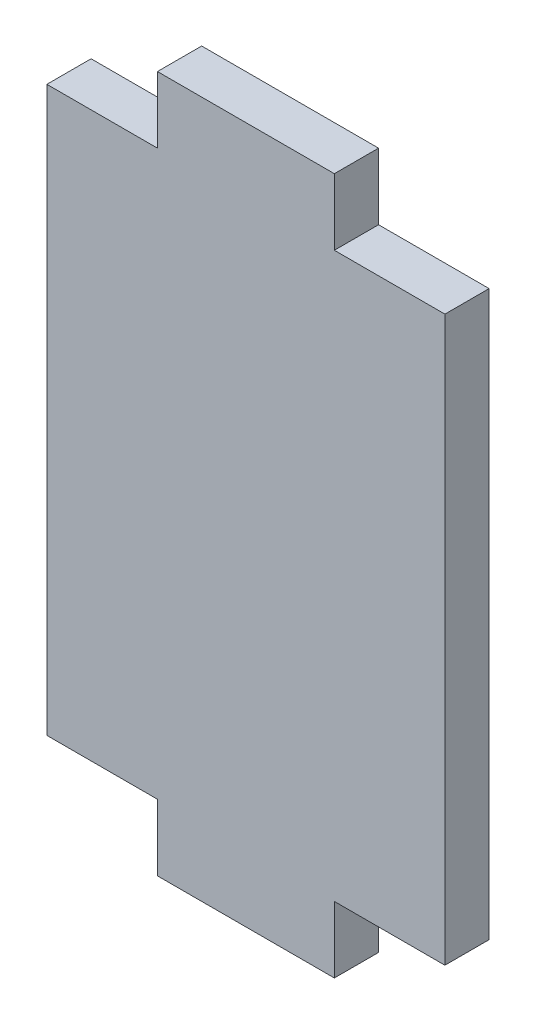
ISO-10303-21;
HEADER;
FILE_DESCRIPTION(('STEP AP214'),'2;1');
FILE_NAME('part.step','',(''),(''),'','','');
FILE_SCHEMA(('AUTOMOTIVE_DESIGN { 1 0 10303 214 1 1 1 1 }'));
ENDSEC;
DATA;
#1=APPLICATION_CONTEXT('core data for automotive mechanical design processes');
#2=APPLICATION_PROTOCOL_DEFINITION('international standard','automotive_design',2000,#1);
#3=PRODUCT_CONTEXT('',#1,'mechanical');
#4=PRODUCT('Part','Part','',(#3));
#5=PRODUCT_RELATED_PRODUCT_CATEGORY('part','',(#4));
#6=PRODUCT_DEFINITION_FORMATION('','',#4);
#7=PRODUCT_DEFINITION_CONTEXT('part definition',#1,'design');
#8=PRODUCT_DEFINITION('design','',#6,#7);
#9=PRODUCT_DEFINITION_SHAPE('','',#8);
#10=(LENGTH_UNIT() NAMED_UNIT(*) SI_UNIT(.MILLI.,.METRE.));
#11=(NAMED_UNIT(*) PLANE_ANGLE_UNIT() SI_UNIT($,.RADIAN.));
#12=(NAMED_UNIT(*) SI_UNIT($,.STERADIAN.) SOLID_ANGLE_UNIT());
#13=UNCERTAINTY_MEASURE_WITH_UNIT(LENGTH_MEASURE(1.E-05),#10,'distance_accuracy_value','');
#14=(GEOMETRIC_REPRESENTATION_CONTEXT(3) GLOBAL_UNCERTAINTY_ASSIGNED_CONTEXT((#13)) GLOBAL_UNIT_ASSIGNED_CONTEXT((#10,
#11,#12)) REPRESENTATION_CONTEXT('',''));
#15=CARTESIAN_POINT('',(0.,0.,0.));
#16=DIRECTION('',(0.,0.,1.));
#17=DIRECTION('',(1.,0.,0.));
#18=AXIS2_PLACEMENT_3D('',#15,#16,#17);
#19=CARTESIAN_POINT('',(0.,0.,2.));
#20=DIRECTION('',(-1.,0.,0.));
#21=DIRECTION('',(0.,0.,1.));
#22=AXIS2_PLACEMENT_3D('',#19,#20,#21);
#23=PLANE('',#22);
#24=DIRECTION('',(0.,1.,0.));
#25=VECTOR('',#24,1.);
#26=CARTESIAN_POINT('',(0.,0.,0.));
#27=LINE('',#26,#25);
#28=CARTESIAN_POINT('',(0.,-3.,0.));
#29=VERTEX_POINT('',#28);
#30=CARTESIAN_POINT('',(0.,0.,0.));
#31=VERTEX_POINT('',#30);
#32=EDGE_CURVE('E152',#29,#31,#27,.T.);
#33=ORIENTED_EDGE('',*,*,#32,.T.);
#34=DIRECTION('',(0.,0.,-1.));
#35=VECTOR('',#34,1.);
#36=CARTESIAN_POINT('',(0.,0.,2.));
#37=LINE('',#36,#35);
#38=CARTESIAN_POINT('',(0.,0.,2.));
#39=VERTEX_POINT('',#38);
#40=EDGE_CURVE('E11',#39,#31,#37,.T.);
#41=ORIENTED_EDGE('',*,*,#40,.F.);
#42=DIRECTION('',(0.,1.,0.));
#43=VECTOR('',#42,1.);
#44=CARTESIAN_POINT('',(0.,0.,2.));
#45=LINE('',#44,#43);
#46=CARTESIAN_POINT('',(0.,-3.,2.));
#47=VERTEX_POINT('',#46);
#48=EDGE_CURVE('E174',#47,#39,#45,.T.);
#49=ORIENTED_EDGE('',*,*,#48,.F.);
#50=DIRECTION('',(0.,0.,-1.));
#51=VECTOR('',#50,1.);
#52=CARTESIAN_POINT('',(0.,-3.,2.));
#53=LINE('',#52,#51);
#54=EDGE_CURVE('E148',#47,#29,#53,.T.);
#55=ORIENTED_EDGE('',*,*,#54,.T.);
#56=EDGE_LOOP('',(#33,#41,#49,#55));
#57=FACE_BOUND('',#56,.T.);
#58=ADVANCED_FACE('F32',(#57),#23,.F.);
#59=CARTESIAN_POINT('',(0.,0.,2.));
#60=DIRECTION('',(0.,-1.,0.));
#61=DIRECTION('',(1.,0.,0.));
#62=AXIS2_PLACEMENT_3D('',#59,#60,#61);
#63=PLANE('',#62);
#64=DIRECTION('',(-1.,0.,0.));
#65=VECTOR('',#64,1.);
#66=CARTESIAN_POINT('',(0.,0.,0.));
#67=LINE('',#66,#65);
#68=CARTESIAN_POINT('',(-8.,0.,0.));
#69=VERTEX_POINT('',#68);
#70=EDGE_CURVE('E155',#31,#69,#67,.T.);
#71=ORIENTED_EDGE('',*,*,#70,.T.);
#72=DIRECTION('',(0.,0.,-1.));
#73=VECTOR('',#72,1.);
#74=CARTESIAN_POINT('',(-8.,0.,2.));
#75=LINE('',#74,#73);
#76=CARTESIAN_POINT('',(-8.,0.,2.));
#77=VERTEX_POINT('',#76);
#78=EDGE_CURVE('E40',#77,#69,#75,.T.);
#79=ORIENTED_EDGE('',*,*,#78,.F.);
#80=DIRECTION('',(-1.,0.,0.));
#81=VECTOR('',#80,1.);
#82=CARTESIAN_POINT('',(0.,0.,2.));
#83=LINE('',#82,#81);
#84=EDGE_CURVE('E103',#39,#77,#83,.T.);
#85=ORIENTED_EDGE('',*,*,#84,.F.);
#86=ORIENTED_EDGE('',*,*,#40,.T.);
#87=EDGE_LOOP('',(#71,#79,#85,#86));
#88=FACE_BOUND('',#87,.T.);
#89=ADVANCED_FACE('F252',(#88),#63,.F.);
#90=CARTESIAN_POINT('',(-8.,0.,2.));
#91=DIRECTION('',(1.,0.,0.));
#92=DIRECTION('',(0.,0.,-1.));
#93=AXIS2_PLACEMENT_3D('',#90,#91,#92);
#94=PLANE('',#93);
#95=DIRECTION('',(0.,-1.,0.));
#96=VECTOR('',#95,1.);
#97=CARTESIAN_POINT('',(-8.,0.,0.));
#98=LINE('',#97,#96);
#99=CARTESIAN_POINT('',(-8.,-3.,0.));
#100=VERTEX_POINT('',#99);
#101=EDGE_CURVE('E157',#69,#100,#98,.T.);
#102=ORIENTED_EDGE('',*,*,#101,.T.);
#103=DIRECTION('',(0.,0.,-1.));
#104=VECTOR('',#103,1.);
#105=CARTESIAN_POINT('',(-8.,-3.,2.));
#106=LINE('',#105,#104);
#107=CARTESIAN_POINT('',(-8.,-3.,2.));
#108=VERTEX_POINT('',#107);
#109=EDGE_CURVE('E193',#108,#100,#106,.T.);
#110=ORIENTED_EDGE('',*,*,#109,.F.);
#111=DIRECTION('',(0.,-1.,0.));
#112=VECTOR('',#111,1.);
#113=CARTESIAN_POINT('',(-8.,0.,2.));
#114=LINE('',#113,#112);
#115=EDGE_CURVE('E201',#77,#108,#114,.T.);
#116=ORIENTED_EDGE('',*,*,#115,.F.);
#117=ORIENTED_EDGE('',*,*,#78,.T.);
#118=EDGE_LOOP('',(#102,#110,#116,#117));
#119=FACE_BOUND('',#118,.T.);
#120=ADVANCED_FACE('F199',(#119),#94,.F.);
#121=CARTESIAN_POINT('',(-8.,-3.,2.));
#122=DIRECTION('',(0.,-1.,0.));
#123=DIRECTION('',(0.,0.,-1.));
#124=AXIS2_PLACEMENT_3D('',#121,#122,#123);
#125=PLANE('',#124);
#126=DIRECTION('',(-1.,0.,0.));
#127=VECTOR('',#126,1.);
#128=CARTESIAN_POINT('',(-8.,-3.,0.));
#129=LINE('',#128,#127);
#130=CARTESIAN_POINT('',(-13.,-3.,0.));
#131=VERTEX_POINT('',#130);
#132=EDGE_CURVE('E159',#100,#131,#129,.T.);
#133=ORIENTED_EDGE('',*,*,#132,.T.);
#134=DIRECTION('',(0.,0.,-1.));
#135=VECTOR('',#134,1.);
#136=CARTESIAN_POINT('',(-13.,-3.,2.));
#137=LINE('',#136,#135);
#138=CARTESIAN_POINT('',(-13.,-3.,2.));
#139=VERTEX_POINT('',#138);
#140=EDGE_CURVE('E190',#139,#131,#137,.T.);
#141=ORIENTED_EDGE('',*,*,#140,.F.);
#142=DIRECTION('',(-1.,0.,0.));
#143=VECTOR('',#142,1.);
#144=CARTESIAN_POINT('',(-8.,-3.,2.));
#145=LINE('',#144,#143);
#146=EDGE_CURVE('E219',#108,#139,#145,.T.);
#147=ORIENTED_EDGE('',*,*,#146,.F.);
#148=ORIENTED_EDGE('',*,*,#109,.T.);
#149=EDGE_LOOP('',(#133,#141,#147,#148));
#150=FACE_BOUND('',#149,.T.);
#151=ADVANCED_FACE('F210',(#150),#125,.F.);
#152=CARTESIAN_POINT('',(-13.,-3.,2.));
#153=DIRECTION('',(1.,0.,0.));
#154=DIRECTION('',(0.,1.,0.));
#155=AXIS2_PLACEMENT_3D('',#152,#153,#154);
#156=PLANE('',#155);
#157=DIRECTION('',(0.,-1.,0.));
#158=VECTOR('',#157,1.);
#159=CARTESIAN_POINT('',(-13.,-3.,0.));
#160=LINE('',#159,#158);
#161=CARTESIAN_POINT('',(-13.,-28.5,0.));
#162=VERTEX_POINT('',#161);
#163=EDGE_CURVE('E161',#131,#162,#160,.T.);
#164=ORIENTED_EDGE('',*,*,#163,.T.);
#165=DIRECTION('',(0.,0.,-1.));
#166=VECTOR('',#165,1.);
#167=CARTESIAN_POINT('',(-13.,-28.5,2.));
#168=LINE('',#167,#166);
#169=CARTESIAN_POINT('',(-13.,-28.5,2.));
#170=VERTEX_POINT('',#169);
#171=EDGE_CURVE('E187',#170,#162,#168,.T.);
#172=ORIENTED_EDGE('',*,*,#171,.F.);
#173=DIRECTION('',(0.,-1.,0.));
#174=VECTOR('',#173,1.);
#175=CARTESIAN_POINT('',(-13.,-3.,2.));
#176=LINE('',#175,#174);
#177=EDGE_CURVE('E216',#139,#170,#176,.T.);
#178=ORIENTED_EDGE('',*,*,#177,.F.);
#179=ORIENTED_EDGE('',*,*,#140,.T.);
#180=EDGE_LOOP('',(#164,#172,#178,#179));
#181=FACE_BOUND('',#180,.T.);
#182=ADVANCED_FACE('F214',(#181),#156,.F.);
#183=CARTESIAN_POINT('',(-8.,-28.5,2.));
#184=DIRECTION('',(0.,1.,0.));
#185=DIRECTION('',(-1.,0.,0.));
#186=AXIS2_PLACEMENT_3D('',#183,#184,#185);
#187=PLANE('',#186);
#188=DIRECTION('',(1.,0.,0.));
#189=VECTOR('',#188,1.);
#190=CARTESIAN_POINT('',(-8.,-28.5,0.));
#191=LINE('',#190,#189);
#192=CARTESIAN_POINT('',(-8.,-28.5,0.));
#193=VERTEX_POINT('',#192);
#194=EDGE_CURVE('E163',#162,#193,#191,.T.);
#195=ORIENTED_EDGE('',*,*,#194,.T.);
#196=DIRECTION('',(0.,0.,-1.));
#197=VECTOR('',#196,1.);
#198=CARTESIAN_POINT('',(-8.,-28.5,2.));
#199=LINE('',#198,#197);
#200=CARTESIAN_POINT('',(-8.,-28.5,2.));
#201=VERTEX_POINT('',#200);
#202=EDGE_CURVE('E184',#201,#193,#199,.T.);
#203=ORIENTED_EDGE('',*,*,#202,.F.);
#204=DIRECTION('',(1.,0.,0.));
#205=VECTOR('',#204,1.);
#206=CARTESIAN_POINT('',(-8.,-28.5,2.));
#207=LINE('',#206,#205);
#208=EDGE_CURVE('E218',#170,#201,#207,.T.);
#209=ORIENTED_EDGE('',*,*,#208,.F.);
#210=ORIENTED_EDGE('',*,*,#171,.T.);
#211=EDGE_LOOP('',(#195,#203,#209,#210));
#212=FACE_BOUND('',#211,.T.);
#213=ADVANCED_FACE('F265',(#212),#187,.F.);
#214=CARTESIAN_POINT('',(-8.,-31.5,2.));
#215=DIRECTION('',(1.,0.,0.));
#216=DIRECTION('',(0.,0.,-1.));
#217=AXIS2_PLACEMENT_3D('',#214,#215,#216);
#218=PLANE('',#217);
#219=DIRECTION('',(0.,-1.,0.));
#220=VECTOR('',#219,1.);
#221=CARTESIAN_POINT('',(-8.,-31.5,0.));
#222=LINE('',#221,#220);
#223=CARTESIAN_POINT('',(-8.,-31.5,0.));
#224=VERTEX_POINT('',#223);
#225=EDGE_CURVE('E165',#193,#224,#222,.T.);
#226=ORIENTED_EDGE('',*,*,#225,.T.);
#227=DIRECTION('',(0.,0.,-1.));
#228=VECTOR('',#227,1.);
#229=CARTESIAN_POINT('',(-8.,-31.5,2.));
#230=LINE('',#229,#228);
#231=CARTESIAN_POINT('',(-8.,-31.5,2.));
#232=VERTEX_POINT('',#231);
#233=EDGE_CURVE('E181',#232,#224,#230,.T.);
#234=ORIENTED_EDGE('',*,*,#233,.F.);
#235=DIRECTION('',(0.,-1.,0.));
#236=VECTOR('',#235,1.);
#237=CARTESIAN_POINT('',(-8.,-31.5,2.));
#238=LINE('',#237,#236);
#239=EDGE_CURVE('E221',#201,#232,#238,.T.);
#240=ORIENTED_EDGE('',*,*,#239,.F.);
#241=ORIENTED_EDGE('',*,*,#202,.T.);
#242=EDGE_LOOP('',(#226,#234,#240,#241));
#243=FACE_BOUND('',#242,.T.);
#244=ADVANCED_FACE('F268',(#243),#218,.F.);
#245=CARTESIAN_POINT('',(0.,-31.5,2.));
#246=DIRECTION('',(0.,1.,0.));
#247=DIRECTION('',(0.,0.,1.));
#248=AXIS2_PLACEMENT_3D('',#245,#246,#247);
#249=PLANE('',#248);
#250=DIRECTION('',(1.,0.,0.));
#251=VECTOR('',#250,1.);
#252=CARTESIAN_POINT('',(0.,-31.5,0.));
#253=LINE('',#252,#251);
#254=CARTESIAN_POINT('',(0.,-31.5,0.));
#255=VERTEX_POINT('',#254);
#256=EDGE_CURVE('E167',#224,#255,#253,.T.);
#257=ORIENTED_EDGE('',*,*,#256,.T.);
#258=DIRECTION('',(0.,0.,-1.));
#259=VECTOR('',#258,1.);
#260=CARTESIAN_POINT('',(0.,-31.5,2.));
#261=LINE('',#260,#259);
#262=CARTESIAN_POINT('',(0.,-31.5,2.));
#263=VERTEX_POINT('',#262);
#264=EDGE_CURVE('E178',#263,#255,#261,.T.);
#265=ORIENTED_EDGE('',*,*,#264,.F.);
#266=DIRECTION('',(1.,0.,0.));
#267=VECTOR('',#266,1.);
#268=CARTESIAN_POINT('',(0.,-31.5,2.));
#269=LINE('',#268,#267);
#270=EDGE_CURVE('E227',#232,#263,#269,.T.);
#271=ORIENTED_EDGE('',*,*,#270,.F.);
#272=ORIENTED_EDGE('',*,*,#233,.T.);
#273=EDGE_LOOP('',(#257,#265,#271,#272));
#274=FACE_BOUND('',#273,.T.);
#275=ADVANCED_FACE('F233',(#274),#249,.F.);
#276=CARTESIAN_POINT('',(0.,-31.5,2.));
#277=DIRECTION('',(-1.,0.,0.));
#278=DIRECTION('',(0.,0.,1.));
#279=AXIS2_PLACEMENT_3D('',#276,#277,#278);
#280=PLANE('',#279);
#281=DIRECTION('',(0.,1.,0.));
#282=VECTOR('',#281,1.);
#283=CARTESIAN_POINT('',(0.,-31.5,0.));
#284=LINE('',#283,#282);
#285=CARTESIAN_POINT('',(0.,-28.5,0.));
#286=VERTEX_POINT('',#285);
#287=EDGE_CURVE('E169',#255,#286,#284,.T.);
#288=ORIENTED_EDGE('',*,*,#287,.T.);
#289=DIRECTION('',(0.,0.,-1.));
#290=VECTOR('',#289,1.);
#291=CARTESIAN_POINT('',(0.,-28.5,2.));
#292=LINE('',#291,#290);
#293=CARTESIAN_POINT('',(0.,-28.5,2.));
#294=VERTEX_POINT('',#293);
#295=EDGE_CURVE('E143',#294,#286,#292,.T.);
#296=ORIENTED_EDGE('',*,*,#295,.F.);
#297=DIRECTION('',(0.,1.,0.));
#298=VECTOR('',#297,1.);
#299=CARTESIAN_POINT('',(0.,-31.5,2.));
#300=LINE('',#299,#298);
#301=EDGE_CURVE('E134',#263,#294,#300,.T.);
#302=ORIENTED_EDGE('',*,*,#301,.F.);
#303=ORIENTED_EDGE('',*,*,#264,.T.);
#304=EDGE_LOOP('',(#288,#296,#302,#303));
#305=FACE_BOUND('',#304,.T.);
#306=ADVANCED_FACE('F237',(#305),#280,.F.);
#307=CARTESIAN_POINT('',(0.,-28.5,2.));
#308=DIRECTION('',(0.,1.,0.));
#309=DIRECTION('',(0.,0.,1.));
#310=AXIS2_PLACEMENT_3D('',#307,#308,#309);
#311=PLANE('',#310);
#312=DIRECTION('',(1.,0.,0.));
#313=VECTOR('',#312,1.);
#314=CARTESIAN_POINT('',(0.,-28.5,0.));
#315=LINE('',#314,#313);
#316=CARTESIAN_POINT('',(5.,-28.5,0.));
#317=VERTEX_POINT('',#316);
#318=EDGE_CURVE('E142',#286,#317,#315,.T.);
#319=ORIENTED_EDGE('',*,*,#318,.T.);
#320=DIRECTION('',(0.,0.,-1.));
#321=VECTOR('',#320,1.);
#322=CARTESIAN_POINT('',(5.,-28.5,2.));
#323=LINE('',#322,#321);
#324=CARTESIAN_POINT('',(5.,-28.5,2.));
#325=VERTEX_POINT('',#324);
#326=EDGE_CURVE('E139',#325,#317,#323,.T.);
#327=ORIENTED_EDGE('',*,*,#326,.F.);
#328=DIRECTION('',(1.,0.,0.));
#329=VECTOR('',#328,1.);
#330=CARTESIAN_POINT('',(0.,-28.5,2.));
#331=LINE('',#330,#329);
#332=EDGE_CURVE('E128',#294,#325,#331,.T.);
#333=ORIENTED_EDGE('',*,*,#332,.F.);
#334=ORIENTED_EDGE('',*,*,#295,.T.);
#335=EDGE_LOOP('',(#319,#327,#333,#334));
#336=FACE_BOUND('',#335,.T.);
#337=ADVANCED_FACE('F140',(#336),#311,.F.);
#338=CARTESIAN_POINT('',(5.,-28.5,2.));
#339=DIRECTION('',(-1.,0.,0.));
#340=DIRECTION('',(0.,0.,1.));
#341=AXIS2_PLACEMENT_3D('',#338,#339,#340);
#342=PLANE('',#341);
#343=DIRECTION('',(0.,1.,0.));
#344=VECTOR('',#343,1.);
#345=CARTESIAN_POINT('',(5.,-28.5,0.));
#346=LINE('',#345,#344);
#347=CARTESIAN_POINT('',(5.,-3.,0.));
#348=VERTEX_POINT('',#347);
#349=EDGE_CURVE('E89',#317,#348,#346,.T.);
#350=ORIENTED_EDGE('',*,*,#349,.T.);
#351=DIRECTION('',(0.,0.,-1.));
#352=VECTOR('',#351,1.);
#353=CARTESIAN_POINT('',(5.,-3.,2.));
#354=LINE('',#353,#352);
#355=CARTESIAN_POINT('',(5.,-3.,2.));
#356=VERTEX_POINT('',#355);
#357=EDGE_CURVE('E144',#356,#348,#354,.T.);
#358=ORIENTED_EDGE('',*,*,#357,.F.);
#359=DIRECTION('',(0.,1.,0.));
#360=VECTOR('',#359,1.);
#361=CARTESIAN_POINT('',(5.,-28.5,2.));
#362=LINE('',#361,#360);
#363=EDGE_CURVE('E132',#325,#356,#362,.T.);
#364=ORIENTED_EDGE('',*,*,#363,.F.);
#365=ORIENTED_EDGE('',*,*,#326,.T.);
#366=EDGE_LOOP('',(#350,#358,#364,#365));
#367=FACE_BOUND('',#366,.T.);
#368=ADVANCED_FACE('F146',(#367),#342,.F.);
#369=CARTESIAN_POINT('',(0.,-3.,2.));
#370=DIRECTION('',(0.,-1.,0.));
#371=DIRECTION('',(1.,0.,0.));
#372=AXIS2_PLACEMENT_3D('',#369,#370,#371);
#373=PLANE('',#372);
#374=DIRECTION('',(-1.,0.,0.));
#375=VECTOR('',#374,1.);
#376=CARTESIAN_POINT('',(0.,-3.,0.));
#377=LINE('',#376,#375);
#378=EDGE_CURVE('E95',#348,#29,#377,.T.);
#379=ORIENTED_EDGE('',*,*,#378,.T.);
#380=ORIENTED_EDGE('',*,*,#54,.F.);
#381=DIRECTION('',(-1.,0.,0.));
#382=VECTOR('',#381,1.);
#383=CARTESIAN_POINT('',(0.,-3.,2.));
#384=LINE('',#383,#382);
#385=EDGE_CURVE('E48',#356,#47,#384,.T.);
#386=ORIENTED_EDGE('',*,*,#385,.F.);
#387=ORIENTED_EDGE('',*,*,#357,.T.);
#388=EDGE_LOOP('',(#379,#380,#386,#387));
#389=FACE_BOUND('',#388,.T.);
#390=ADVANCED_FACE('F241',(#389),#373,.F.);
#391=CARTESIAN_POINT('',(0.,0.,2.));
#392=DIRECTION('',(0.,0.,1.));
#393=DIRECTION('',(1.,0.,0.));
#394=AXIS2_PLACEMENT_3D('',#391,#392,#393);
#395=PLANE('',#394);
#396=ORIENTED_EDGE('',*,*,#48,.T.);
#397=ORIENTED_EDGE('',*,*,#84,.T.);
#398=ORIENTED_EDGE('',*,*,#115,.T.);
#399=ORIENTED_EDGE('',*,*,#146,.T.);
#400=ORIENTED_EDGE('',*,*,#177,.T.);
#401=ORIENTED_EDGE('',*,*,#208,.T.);
#402=ORIENTED_EDGE('',*,*,#239,.T.);
#403=ORIENTED_EDGE('',*,*,#270,.T.);
#404=ORIENTED_EDGE('',*,*,#301,.T.);
#405=ORIENTED_EDGE('',*,*,#332,.T.);
#406=ORIENTED_EDGE('',*,*,#363,.T.);
#407=ORIENTED_EDGE('',*,*,#385,.T.);
#408=EDGE_LOOP('',(#396,#397,#398,#399,#400,#401,#402,#403,#404,#405,#406,#407));
#409=FACE_BOUND('',#408,.T.);
#410=ADVANCED_FACE('F130',(#409),#395,.T.);
#411=CARTESIAN_POINT('',(0.,0.,0.));
#412=DIRECTION('',(0.,0.,1.));
#413=DIRECTION('',(1.,0.,0.));
#414=AXIS2_PLACEMENT_3D('',#411,#412,#413);
#415=PLANE('',#414);
#416=ORIENTED_EDGE('',*,*,#32,.F.);
#417=ORIENTED_EDGE('',*,*,#378,.F.);
#418=ORIENTED_EDGE('',*,*,#349,.F.);
#419=ORIENTED_EDGE('',*,*,#318,.F.);
#420=ORIENTED_EDGE('',*,*,#287,.F.);
#421=ORIENTED_EDGE('',*,*,#256,.F.);
#422=ORIENTED_EDGE('',*,*,#225,.F.);
#423=ORIENTED_EDGE('',*,*,#194,.F.);
#424=ORIENTED_EDGE('',*,*,#163,.F.);
#425=ORIENTED_EDGE('',*,*,#132,.F.);
#426=ORIENTED_EDGE('',*,*,#101,.F.);
#427=ORIENTED_EDGE('',*,*,#70,.F.);
#428=EDGE_LOOP('',(#416,#417,#418,#419,#420,#421,#422,#423,#424,#425,#426,#427));
#429=FACE_BOUND('',#428,.T.);
#430=ADVANCED_FACE('F205',(#429),#415,.F.);
#431=CLOSED_SHELL('',(#58,#89,#120,#151,#182,#213,#244,#275,#306,#337,#368,#390,#410,#430));
#432=MANIFOLD_SOLID_BREP('B2',#431);
#433=ADVANCED_BREP_SHAPE_REPRESENTATION('',(#18,#432),#14);
#434=SHAPE_DEFINITION_REPRESENTATION(#9,#433);
ENDSEC;
END-ISO-10303-21;
